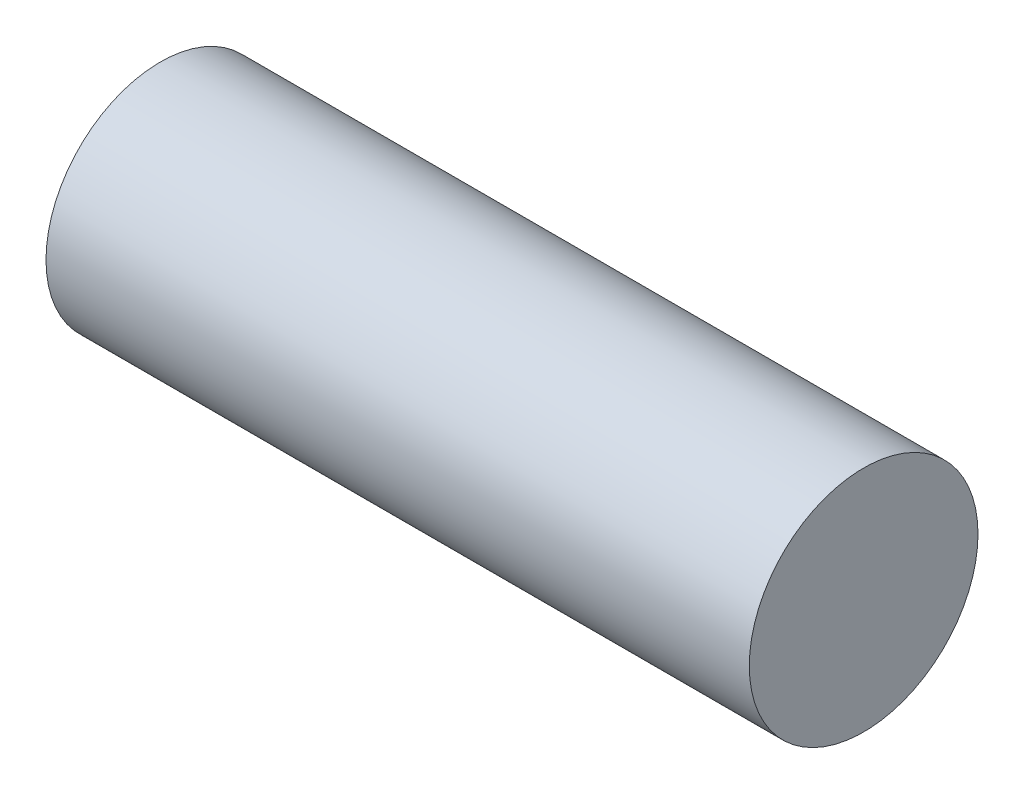
ISO-10303-21;
HEADER;
FILE_DESCRIPTION(('STEP AP214'),'2;1');
FILE_NAME('part.step','',(''),(''),'','','');
FILE_SCHEMA(('AUTOMOTIVE_DESIGN { 1 0 10303 214 1 1 1 1 }'));
ENDSEC;
DATA;
#1=APPLICATION_CONTEXT('core data for automotive mechanical design processes');
#2=APPLICATION_PROTOCOL_DEFINITION('international standard','automotive_design',2000,#1);
#3=PRODUCT_CONTEXT('',#1,'mechanical');
#4=PRODUCT('Part','Part','',(#3));
#5=PRODUCT_RELATED_PRODUCT_CATEGORY('part','',(#4));
#6=PRODUCT_DEFINITION_FORMATION('','',#4);
#7=PRODUCT_DEFINITION_CONTEXT('part definition',#1,'design');
#8=PRODUCT_DEFINITION('design','',#6,#7);
#9=PRODUCT_DEFINITION_SHAPE('','',#8);
#10=(LENGTH_UNIT() NAMED_UNIT(*) SI_UNIT(.MILLI.,.METRE.));
#11=(NAMED_UNIT(*) PLANE_ANGLE_UNIT() SI_UNIT($,.RADIAN.));
#12=(NAMED_UNIT(*) SI_UNIT($,.STERADIAN.) SOLID_ANGLE_UNIT());
#13=UNCERTAINTY_MEASURE_WITH_UNIT(LENGTH_MEASURE(1.E-05),#10,'distance_accuracy_value','');
#14=(GEOMETRIC_REPRESENTATION_CONTEXT(3) GLOBAL_UNCERTAINTY_ASSIGNED_CONTEXT((#13)) GLOBAL_UNIT_ASSIGNED_CONTEXT((#10,
#11,#12)) REPRESENTATION_CONTEXT('',''));
#15=CARTESIAN_POINT('',(0.,0.,0.));
#16=DIRECTION('',(0.,0.,1.));
#17=DIRECTION('',(1.,0.,0.));
#18=AXIS2_PLACEMENT_3D('',#15,#16,#17);
#19=CARTESIAN_POINT('',(-1000.,0.,0.));
#20=DIRECTION('',(-1.,0.,0.));
#21=DIRECTION('',(0.,0.,1.));
#22=AXIS2_PLACEMENT_3D('',#19,#20,#21);
#23=CYLINDRICAL_SURFACE('',#22,3.);
#24=CARTESIAN_POINT('',(80.5,0.,0.));
#25=DIRECTION('',(-1.,0.,0.));
#26=DIRECTION('',(0.,0.,1.));
#27=AXIS2_PLACEMENT_3D('',#24,#25,#26);
#28=CIRCLE('',#27,3.);
#29=CARTESIAN_POINT('',(80.5,0.,3.));
#30=VERTEX_POINT('',#29);
#31=EDGE_CURVE('E10',#30,#30,#28,.T.);
#32=ORIENTED_EDGE('',*,*,#31,.F.);
#33=EDGE_LOOP('',(#32));
#34=FACE_BOUND('',#33,.T.);
#35=CARTESIAN_POINT('',(98.9500000000001,0.,0.));
#36=DIRECTION('',(1.,0.,0.));
#37=DIRECTION('',(0.,0.,-1.));
#38=AXIS2_PLACEMENT_3D('',#35,#36,#37);
#39=CIRCLE('',#38,3.);
#40=CARTESIAN_POINT('',(98.9500000000001,0.,-3.));
#41=VERTEX_POINT('',#40);
#42=EDGE_CURVE('E43',#41,#41,#39,.T.);
#43=ORIENTED_EDGE('',*,*,#42,.F.);
#44=EDGE_LOOP('',(#43));
#45=FACE_BOUND('',#44,.T.);
#46=ADVANCED_FACE('F39',(#34,#45),#23,.T.);
#47=CARTESIAN_POINT('',(80.5,0.,0.));
#48=DIRECTION('',(1.,0.,0.));
#49=DIRECTION('',(0.,0.,-1.));
#50=AXIS2_PLACEMENT_3D('',#47,#48,#49);
#51=PLANE('',#50);
#52=ORIENTED_EDGE('',*,*,#31,.T.);
#53=EDGE_LOOP('',(#52));
#54=FACE_BOUND('',#53,.T.);
#55=ADVANCED_FACE('F41',(#54),#51,.F.);
#56=CARTESIAN_POINT('',(98.95,4.,0.));
#57=DIRECTION('',(1.,0.,0.));
#58=DIRECTION('',(0.,0.,-1.));
#59=AXIS2_PLACEMENT_3D('',#56,#57,#58);
#60=PLANE('',#59);
#61=ORIENTED_EDGE('',*,*,#42,.T.);
#62=EDGE_LOOP('',(#61));
#63=FACE_BOUND('',#62,.T.);
#64=ADVANCED_FACE('F55',(#63),#60,.T.);
#65=CLOSED_SHELL('',(#46,#55,#64));
#66=MANIFOLD_SOLID_BREP('B2',#65);
#67=ADVANCED_BREP_SHAPE_REPRESENTATION('',(#18,#66),#14);
#68=SHAPE_DEFINITION_REPRESENTATION(#9,#67);
ENDSEC;
END-ISO-10303-21;
